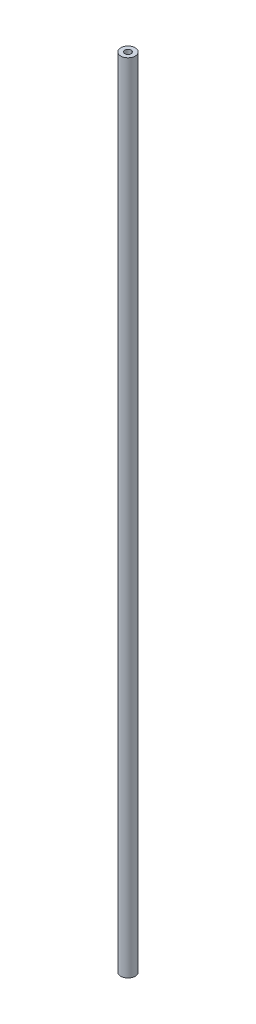
ISO-10303-21;
HEADER;
FILE_DESCRIPTION(('STEP AP214'),'2;1');
FILE_NAME('part.step','',(''),(''),'','','');
FILE_SCHEMA(('AUTOMOTIVE_DESIGN { 1 0 10303 214 1 1 1 1 }'));
ENDSEC;
DATA;
#1=APPLICATION_CONTEXT('core data for automotive mechanical design processes');
#2=APPLICATION_PROTOCOL_DEFINITION('international standard','automotive_design',2000,#1);
#3=PRODUCT_CONTEXT('',#1,'mechanical');
#4=PRODUCT('Part','Part','',(#3));
#5=PRODUCT_RELATED_PRODUCT_CATEGORY('part','',(#4));
#6=PRODUCT_DEFINITION_FORMATION('','',#4);
#7=PRODUCT_DEFINITION_CONTEXT('part definition',#1,'design');
#8=PRODUCT_DEFINITION('design','',#6,#7);
#9=PRODUCT_DEFINITION_SHAPE('','',#8);
#10=(LENGTH_UNIT() NAMED_UNIT(*) SI_UNIT(.MILLI.,.METRE.));
#11=(NAMED_UNIT(*) PLANE_ANGLE_UNIT() SI_UNIT($,.RADIAN.));
#12=(NAMED_UNIT(*) SI_UNIT($,.STERADIAN.) SOLID_ANGLE_UNIT());
#13=UNCERTAINTY_MEASURE_WITH_UNIT(LENGTH_MEASURE(1.E-05),#10,'distance_accuracy_value','');
#14=(GEOMETRIC_REPRESENTATION_CONTEXT(3) GLOBAL_UNCERTAINTY_ASSIGNED_CONTEXT((#13)) GLOBAL_UNIT_ASSIGNED_CONTEXT((#10,
#11,#12)) REPRESENTATION_CONTEXT('',''));
#15=CARTESIAN_POINT('',(0.,0.,0.));
#16=DIRECTION('',(0.,0.,1.));
#17=DIRECTION('',(1.,0.,0.));
#18=AXIS2_PLACEMENT_3D('',#15,#16,#17);
#19=CARTESIAN_POINT('',(0.,27.57,0.));
#20=DIRECTION('',(0.,1.,0.));
#21=DIRECTION('',(0.,0.,1.));
#22=AXIS2_PLACEMENT_3D('',#19,#20,#21);
#23=PLANE('',#22);
#24=CARTESIAN_POINT('',(0.,27.57,0.));
#25=DIRECTION('',(0.,1.,0.));
#26=DIRECTION('',(0.,0.,1.));
#27=AXIS2_PLACEMENT_3D('',#24,#25,#26);
#28=CIRCLE('',#27,0.25);
#29=CARTESIAN_POINT('',(0.,27.57,0.25));
#30=VERTEX_POINT('',#29);
#31=EDGE_CURVE('E10',#30,#30,#28,.T.);
#32=ORIENTED_EDGE('',*,*,#31,.T.);
#33=EDGE_LOOP('',(#32));
#34=FACE_BOUND('',#33,.T.);
#35=CARTESIAN_POINT('',(0.,27.57,0.));
#36=DIRECTION('',(0.,1.,0.));
#37=DIRECTION('',(0.,0.,1.));
#38=AXIS2_PLACEMENT_3D('',#35,#36,#37);
#39=CIRCLE('',#38,0.11);
#40=CARTESIAN_POINT('',(0.,27.57,0.11));
#41=VERTEX_POINT('',#40);
#42=EDGE_CURVE('E42',#41,#41,#39,.T.);
#43=ORIENTED_EDGE('',*,*,#42,.F.);
#44=EDGE_LOOP('',(#43));
#45=FACE_BOUND('',#44,.T.);
#46=ADVANCED_FACE('F31',(#34,#45),#23,.T.);
#47=CARTESIAN_POINT('',(0.,0.,0.));
#48=DIRECTION('',(0.,1.,0.));
#49=DIRECTION('',(0.,0.,1.));
#50=AXIS2_PLACEMENT_3D('',#47,#48,#49);
#51=PLANE('',#50);
#52=CARTESIAN_POINT('',(0.,0.,0.));
#53=DIRECTION('',(0.,1.,0.));
#54=DIRECTION('',(0.,0.,1.));
#55=AXIS2_PLACEMENT_3D('',#52,#53,#54);
#56=CIRCLE('',#55,0.25);
#57=CARTESIAN_POINT('',(0.,0.,0.25));
#58=VERTEX_POINT('',#57);
#59=EDGE_CURVE('E35',#58,#58,#56,.T.);
#60=ORIENTED_EDGE('',*,*,#59,.F.);
#61=EDGE_LOOP('',(#60));
#62=FACE_BOUND('',#61,.T.);
#63=CARTESIAN_POINT('',(0.,0.,0.));
#64=DIRECTION('',(0.,1.,0.));
#65=DIRECTION('',(0.,0.,1.));
#66=AXIS2_PLACEMENT_3D('',#63,#64,#65);
#67=CIRCLE('',#66,0.11);
#68=CARTESIAN_POINT('',(0.,0.,0.11));
#69=VERTEX_POINT('',#68);
#70=EDGE_CURVE('E44',#69,#69,#67,.T.);
#71=ORIENTED_EDGE('',*,*,#70,.T.);
#72=EDGE_LOOP('',(#71));
#73=FACE_BOUND('',#72,.T.);
#74=ADVANCED_FACE('F54',(#62,#73),#51,.F.);
#75=CARTESIAN_POINT('',(0.,27.57,0.));
#76=DIRECTION('',(0.,-1.,0.));
#77=DIRECTION('',(0.,0.,-1.));
#78=AXIS2_PLACEMENT_3D('',#75,#76,#77);
#79=CYLINDRICAL_SURFACE('',#78,0.25);
#80=ORIENTED_EDGE('',*,*,#31,.F.);
#81=EDGE_LOOP('',(#80));
#82=FACE_BOUND('',#81,.T.);
#83=ORIENTED_EDGE('',*,*,#59,.T.);
#84=EDGE_LOOP('',(#83));
#85=FACE_BOUND('',#84,.T.);
#86=ADVANCED_FACE('F33',(#82,#85),#79,.T.);
#87=CARTESIAN_POINT('',(0.,27.57,0.));
#88=DIRECTION('',(0.,-1.,0.));
#89=DIRECTION('',(0.,0.,-1.));
#90=AXIS2_PLACEMENT_3D('',#87,#88,#89);
#91=CYLINDRICAL_SURFACE('',#90,0.11);
#92=ORIENTED_EDGE('',*,*,#42,.T.);
#93=EDGE_LOOP('',(#92));
#94=FACE_BOUND('',#93,.T.);
#95=ORIENTED_EDGE('',*,*,#70,.F.);
#96=EDGE_LOOP('',(#95));
#97=FACE_BOUND('',#96,.T.);
#98=ADVANCED_FACE('F50',(#94,#97),#91,.F.);
#99=CLOSED_SHELL('',(#46,#74,#86,#98));
#100=MANIFOLD_SOLID_BREP('B2',#99);
#101=ADVANCED_BREP_SHAPE_REPRESENTATION('',(#18,#100),#14);
#102=SHAPE_DEFINITION_REPRESENTATION(#9,#101);
ENDSEC;
END-ISO-10303-21;
